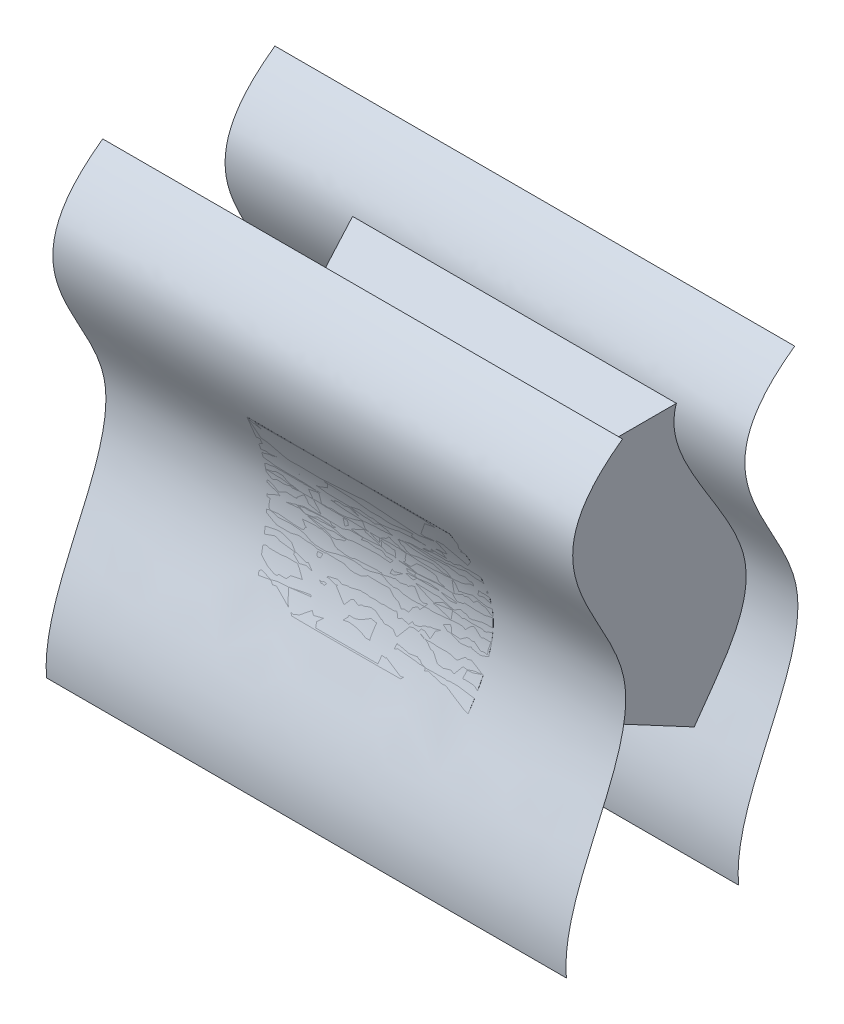
ISO-10303-21;
HEADER;
FILE_DESCRIPTION(('STEP AP214'),'2;1');
FILE_NAME('part.step','',(''),(''),'','','');
FILE_SCHEMA(('AUTOMOTIVE_DESIGN { 1 0 10303 214 1 1 1 1 }'));
ENDSEC;
DATA;
#1=APPLICATION_CONTEXT('core data for automotive mechanical design processes');
#2=APPLICATION_PROTOCOL_DEFINITION('international standard','automotive_design',2000,#1);
#3=PRODUCT_CONTEXT('',#1,'mechanical');
#4=PRODUCT('Part','Part','',(#3));
#5=PRODUCT_RELATED_PRODUCT_CATEGORY('part','',(#4));
#6=PRODUCT_DEFINITION_FORMATION('','',#4);
#7=PRODUCT_DEFINITION_CONTEXT('part definition',#1,'design');
#8=PRODUCT_DEFINITION('design','',#6,#7);
#9=PRODUCT_DEFINITION_SHAPE('','',#8);
#10=(LENGTH_UNIT() NAMED_UNIT(*) SI_UNIT(.MILLI.,.METRE.));
#11=(NAMED_UNIT(*) PLANE_ANGLE_UNIT() SI_UNIT($,.RADIAN.));
#12=(NAMED_UNIT(*) SI_UNIT($,.STERADIAN.) SOLID_ANGLE_UNIT());
#13=UNCERTAINTY_MEASURE_WITH_UNIT(LENGTH_MEASURE(1.E-05),#10,'distance_accuracy_value','');
#14=(GEOMETRIC_REPRESENTATION_CONTEXT(3) GLOBAL_UNCERTAINTY_ASSIGNED_CONTEXT((#13)) GLOBAL_UNIT_ASSIGNED_CONTEXT((#10,
#11,#12)) REPRESENTATION_CONTEXT('',''));
#15=CARTESIAN_POINT('',(0.,0.,0.));
#16=DIRECTION('',(0.,0.,1.));
#17=DIRECTION('',(1.,0.,0.));
#18=AXIS2_PLACEMENT_3D('',#15,#16,#17);
#19=CARTESIAN_POINT('',(-1.52422926449016,4.01313395986018,2.66228518325588));
#20=CARTESIAN_POINT('',(-1.52422926449016,-4.69428085802712,14.918114521293));
#21=CARTESIAN_POINT('',(-1.52422926449016,-20.0739613564952,-7.61610162007118));
#22=CARTESIAN_POINT('',(-1.52422926449016,-37.4957926802031,9.91644933925024));
#23=CARTESIAN_POINT('',(-1.52422926449016,-46.626542049612,9.14556550280767));
#24=B_SPLINE_CURVE_WITH_KNOTS('',3,(#19,#20,#21,#22,#23),.UNSPECIFIED.,.F.,.F.,(4,1,4),(0.,
0.484609084090598,1.),.UNSPECIFIED.);
#25=DIRECTION('',(1.,0.,0.));
#26=VECTOR('',#25,1.);
#27=SURFACE_OF_LINEAR_EXTRUSION('',#24,#26);
#28=CARTESIAN_POINT('',(48.4757707355098,4.01313395986018,2.66228518325588));
#29=CARTESIAN_POINT('',(48.4757707355098,-4.69428085802712,14.918114521293));
#30=CARTESIAN_POINT('',(48.4757707355098,-20.0739613564952,-7.61610162007118));
#31=CARTESIAN_POINT('',(48.4757707355098,-37.4957926802031,9.91644933925024));
#32=CARTESIAN_POINT('',(48.4757707355098,-46.626542049612,9.14556550280767));
#33=B_SPLINE_CURVE_WITH_KNOTS('',3,(#28,#29,#30,#31,#32),.UNSPECIFIED.,.F.,.F.,(4,1,4),(0.,
0.484609084090598,1.),.UNSPECIFIED.);
#34=CARTESIAN_POINT('',(48.4757707355098,4.01313395986018,2.66228518325588));
#35=VERTEX_POINT('',#34);
#36=CARTESIAN_POINT('',(48.4757707355098,-46.626542049612,9.14556550280767));
#37=VERTEX_POINT('',#36);
#38=EDGE_CURVE('E61',#35,#37,#33,.T.);
#39=ORIENTED_EDGE('',*,*,#38,.F.);
#40=DIRECTION('',(1.,0.,0.));
#41=VECTOR('',#40,1.);
#42=CARTESIAN_POINT('',(-1.52422926449016,4.01313395986018,2.66228518325588));
#43=LINE('',#42,#41);
#44=CARTESIAN_POINT('',(-11.5242292644902,4.01313395986018,2.66228518325588));
#45=VERTEX_POINT('',#44);
#46=EDGE_CURVE('E53',#45,#35,#43,.T.);
#47=ORIENTED_EDGE('',*,*,#46,.F.);
#48=CARTESIAN_POINT('',(-11.5242292644902,4.01313395986018,2.66228518325588));
#49=CARTESIAN_POINT('',(-11.5242292644902,-4.69428085802712,14.918114521293));
#50=CARTESIAN_POINT('',(-11.5242292644902,-20.0739613564952,-7.61610162007118));
#51=CARTESIAN_POINT('',(-11.5242292644902,-37.4957926802031,9.91644933925024));
#52=CARTESIAN_POINT('',(-11.5242292644902,-46.626542049612,9.14556550280767));
#53=B_SPLINE_CURVE_WITH_KNOTS('',3,(#48,#49,#50,#51,#52),.UNSPECIFIED.,.F.,.F.,(4,1,4),(0.,
0.484609084090598,1.),.UNSPECIFIED.);
#54=CARTESIAN_POINT('',(-11.5242292644902,-46.626542049612,9.14556550280767));
#55=VERTEX_POINT('',#54);
#56=EDGE_CURVE('E71',#45,#55,#53,.T.);
#57=ORIENTED_EDGE('',*,*,#56,.T.);
#58=DIRECTION('',(1.,0.,0.));
#59=VECTOR('',#58,1.);
#60=CARTESIAN_POINT('',(-1.52422926449016,-46.626542049612,9.14556550280767));
#61=LINE('',#60,#59);
#62=EDGE_CURVE('E12',#55,#37,#61,.T.);
#63=ORIENTED_EDGE('',*,*,#62,.T.);
#64=EDGE_LOOP('',(#39,#47,#57,#63));
#65=FACE_BOUND('',#64,.T.);
#66=ADVANCED_FACE('F51',(#65),#27,.T.);
#67=OPEN_SHELL('',(#66));
#68=SHELL_BASED_SURFACE_MODEL('B2',(#67));
#69=CARTESIAN_POINT('',(0.,6.18998145234106,24.0617093417306));
#70=CARTESIAN_POINT('',(0.,-2.51743336554624,36.3175386797677));
#71=CARTESIAN_POINT('',(0.,-17.8971138640143,13.7833225384035));
#72=CARTESIAN_POINT('',(0.,-35.3189451877222,31.3158734977249));
#73=CARTESIAN_POINT('',(0.,-44.4496945571311,30.5449896612824));
#74=B_SPLINE_CURVE_WITH_KNOTS('',3,(#69,#70,#71,#72,#73),.UNSPECIFIED.,.F.,.F.,(4,1,4),(0.,
0.484609084090598,1.),.UNSPECIFIED.);
#75=DIRECTION('',(1.,0.,0.));
#76=VECTOR('',#75,1.);
#77=SURFACE_OF_LINEAR_EXTRUSION('',#74,#76);
#78=CARTESIAN_POINT('',(50.,6.18998145234106,24.0617093417306));
#79=CARTESIAN_POINT('',(50.,-2.51743336554624,36.3175386797677));
#80=CARTESIAN_POINT('',(50.,-17.8971138640143,13.7833225384035));
#81=CARTESIAN_POINT('',(50.,-35.3189451877222,31.3158734977249));
#82=CARTESIAN_POINT('',(50.,-44.4496945571311,30.5449896612824));
#83=B_SPLINE_CURVE_WITH_KNOTS('',3,(#78,#79,#80,#81,#82),.UNSPECIFIED.,.F.,.F.,(4,1,4),(0.,
0.484609084090598,1.),.UNSPECIFIED.);
#84=CARTESIAN_POINT('',(50.,6.18998145234106,24.0617093417306));
#85=VERTEX_POINT('',#84);
#86=CARTESIAN_POINT('',(50.,-44.4496945571311,30.5449896612824));
#87=VERTEX_POINT('',#86);
#88=EDGE_CURVE('E131',#85,#87,#83,.T.);
#89=ORIENTED_EDGE('',*,*,#88,.F.);
#90=DIRECTION('',(1.,0.,0.));
#91=VECTOR('',#90,1.);
#92=CARTESIAN_POINT('',(0.,6.18998145234106,24.0617093417306));
#93=LINE('',#92,#91);
#94=CARTESIAN_POINT('',(-10.,6.18998145234106,24.0617093417306));
#95=VERTEX_POINT('',#94);
#96=EDGE_CURVE('E123',#95,#85,#93,.T.);
#97=ORIENTED_EDGE('',*,*,#96,.F.);
#98=CARTESIAN_POINT('',(-10.,6.18998145234106,24.0617093417306));
#99=CARTESIAN_POINT('',(-10.,-2.51743336554624,36.3175386797677));
#100=CARTESIAN_POINT('',(-10.,-17.8971138640143,13.7833225384035));
#101=CARTESIAN_POINT('',(-10.,-35.3189451877222,31.3158734977249));
#102=CARTESIAN_POINT('',(-10.,-44.4496945571311,30.5449896612824));
#103=B_SPLINE_CURVE_WITH_KNOTS('',3,(#98,#99,#100,#101,#102),.UNSPECIFIED.,.F.,.F.,(4,1,4),(0.,
0.484609084090598,1.),.UNSPECIFIED.);
#104=CARTESIAN_POINT('',(-10.,-44.4496945571311,30.5449896612824));
#105=VERTEX_POINT('',#104);
#106=EDGE_CURVE('E141',#95,#105,#103,.T.);
#107=ORIENTED_EDGE('',*,*,#106,.T.);
#108=DIRECTION('',(1.,0.,0.));
#109=VECTOR('',#108,1.);
#110=CARTESIAN_POINT('',(0.,-44.4496945571311,30.5449896612824));
#111=LINE('',#110,#109);
#112=EDGE_CURVE('E49',#105,#87,#111,.T.);
#113=ORIENTED_EDGE('',*,*,#112,.T.);
#114=EDGE_LOOP('',(#89,#97,#107,#113));
#115=FACE_BOUND('',#114,.T.);
#116=ADVANCED_FACE('F121',(#115),#77,.T.);
#117=OPEN_SHELL('',(#116));
#118=SHELL_BASED_SURFACE_MODEL('B6',(#117));
#119=CARTESIAN_POINT('',(0.,0.,0.));
#120=DIRECTION('',(-0.939692620785908,0.,0.342020143325669));
#121=DIRECTION('',(0.342020143325669,0.,0.939692620785908));
#122=AXIS2_PLACEMENT_3D('',#119,#120,#121);
#123=PLANE('',#122);
#124=CARTESIAN_POINT('',(2.9876665244987,-2.9876665244987,8.20854631292063));
#125=CARTESIAN_POINT('',(2.9972551182165,-3.10072374419156,8.2348907576446));
#126=CARTESIAN_POINT('',(3.00591501438279,-3.21445332463872,8.2586836268163));
#127=CARTESIAN_POINT('',(3.02135991706898,-3.4429882873727,8.30111814819229));
#128=CARTESIAN_POINT('',(3.02814504045837,-3.55779360213894,8.31976012149285));
#129=CARTESIAN_POINT('',(3.03981520523351,-3.78804972163956,8.35182363569388));
#130=CARTESIAN_POINT('',(3.04470312605109,-3.90349927628609,8.36525308776825));
#131=CARTESIAN_POINT('',(3.05260455180938,-4.13493618541207,8.38696207662065));
#132=CARTESIAN_POINT('',(3.05561804943225,-4.25092354198936,8.39524159329305));
#133=CARTESIAN_POINT('',(3.06180950570983,-4.59515875538895,8.41225247960925));
#134=CARTESIAN_POINT('',(3.06234637991077,-4.82385505361472,8.41372752935344));
#135=CARTESIAN_POINT('',(3.05671077914176,-5.28052847385759,8.3982438434955));
#136=CARTESIAN_POINT('',(3.05053588308327,-5.5085053065874,8.38127845600733));
#137=CARTESIAN_POINT('',(3.02866760758411,-6.04687586202529,8.32119586287096));
#138=CARTESIAN_POINT('',(3.01028556730297,-6.35633966601876,8.27069162227503));
#139=CARTESIAN_POINT('',(2.96396362665807,-6.9690679357488,8.14342313632786));
#140=CARTESIAN_POINT('',(2.93601796933866,-7.27232855058833,8.06664307387097));
#141=CARTESIAN_POINT('',(2.87222734797819,-7.87419434501463,7.89137978211009));
#142=CARTESIAN_POINT('',(2.83632119557993,-8.17274314973624,7.79272843917638));
#143=CARTESIAN_POINT('',(2.75849081821395,-8.7628174569167,7.5788912348157));
#144=CARTESIAN_POINT('',(2.71656905482476,-9.05434577544068,7.46371213652018));
#145=CARTESIAN_POINT('',(2.63678293415388,-9.57507994680996,7.24450157159106));
#146=CARTESIAN_POINT('',(2.59972185619697,-9.80535165069111,7.14267709676381));
#147=CARTESIAN_POINT('',(2.52328357452186,-10.2625973495167,6.93266464387954));
#148=CARTESIAN_POINT('',(2.48390615459335,-10.4895710341463,6.82447607178957));
#149=CARTESIAN_POINT('',(2.40337093254823,-10.9410466552401,6.60320736774985));
#150=CARTESIAN_POINT('',(2.36221155255672,-11.1655461707638,6.49012290062442));
#151=CARTESIAN_POINT('',(2.27864570556818,-11.6125581980294,6.26052762298581));
#152=CARTESIAN_POINT('',(2.23623918007341,-11.8350706159256,6.14401665175139));
#153=CARTESIAN_POINT('',(2.1077458381293,-12.5011640713613,5.79098409620969));
#154=CARTESIAN_POINT('',(2.02048032059958,-12.9427837565999,5.55122405729978));
#155=CARTESIAN_POINT('',(1.84631508206139,-13.8256801063325,5.07270899716217));
#156=CARTESIAN_POINT('',(1.75941499537339,-14.2669561388336,4.83395297123825));
#157=CARTESIAN_POINT('',(1.63182230021199,-14.9330947459998,4.48339492239493));
#158=CARTESIAN_POINT('',(1.58977386371592,-15.155718569538,4.3678677925986));
#159=CARTESIAN_POINT('',(1.50705367905619,-15.6031355269338,4.14059595311289));
#160=CARTESIAN_POINT('',(1.46638185343009,-15.8279285378125,4.02885103059719));
#161=CARTESIAN_POINT('',(1.38694396324922,-16.280299838458,3.81059722107611));
#162=CARTESIAN_POINT('',(1.34817730102155,-16.5078772263868,3.70408669197797));
#163=CARTESIAN_POINT('',(1.27313142200774,-16.9664982385328,3.49789983396441));
#164=CARTESIAN_POINT('',(1.23685183751461,-17.197541344171,3.39822249478234));
#165=CARTESIAN_POINT('',(1.17590221334383,-17.6069550876531,3.23076477864887));
#166=CARTESIAN_POINT('',(1.15055534072074,-17.7844623560215,3.16112481846314));
#167=CARTESIAN_POINT('',(1.10200673914472,-18.142009582896,3.02773863188692));
#168=CARTESIAN_POINT('',(1.0788053061433,-18.3220498868854,2.96399321861653));
#169=CARTESIAN_POINT('',(1.03493528652325,-18.6846723682696,2.84346133031943));
#170=CARTESIAN_POINT('',(1.01426555014238,-18.8672533495548,2.78667169634689));
#171=CARTESIAN_POINT('',(0.975858419927004,-19.2349812477879,2.6811489733341));
#172=CARTESIAN_POINT('',(0.958119990158336,-19.4201272330752,2.63241303808811));
#173=CARTESIAN_POINT('',(0.926134965858192,-19.791575540318,2.54453490606275));
#174=CARTESIAN_POINT('',(0.911863967062016,-19.9778597223472,2.5053256591172));
#175=CARTESIAN_POINT('',(0.88703598731128,-20.3526079267306,2.43711134538137));
#176=CARTESIAN_POINT('',(0.876480354920777,-20.5410727149942,2.4081099837404));
#177=CARTESIAN_POINT('',(0.859003373300636,-20.9194677441431,2.36009237137884));
#178=CARTESIAN_POINT('',(0.852082763682711,-21.1093982752898,2.34107815272473));
#179=CARTESIAN_POINT('',(0.841776206072706,-21.4900314372436,2.31276111841893));
#180=CARTESIAN_POINT('',(0.838389629493185,-21.6807339246855,2.30345657573745));
#181=CARTESIAN_POINT('',(0.834441767041166,-22.123945506082,2.29260991279541));
#182=CARTESIAN_POINT('',(0.83514373425192,-22.3765545472388,2.29453855185616));
#183=CARTESIAN_POINT('',(0.841992367854425,-22.8811376942549,2.31335501803316));
#184=CARTESIAN_POINT('',(0.848139866701164,-23.1331116971299,2.3302451323007));
#185=CARTESIAN_POINT('',(0.865359261704185,-23.63561514478,2.37755503124817));
#186=CARTESIAN_POINT('',(0.876431618087728,-23.8861444523316,2.4079760803921));
#187=CARTESIAN_POINT('',(0.90319702983536,-24.3896302155137,2.48151344479113));
#188=CARTESIAN_POINT('',(0.918968888912201,-24.6425503991794,2.52484627146757));
#189=CARTESIAN_POINT('',(0.954491738095091,-25.1459060199011,2.62244449747225));
#190=CARTESIAN_POINT('',(0.974241807112793,-25.3963420180715,2.67670736613106));
#191=CARTESIAN_POINT('',(1.01719121715819,-25.8945761719755,2.79470990040967));
#192=CARTESIAN_POINT('',(1.04038959960546,-26.1423750403433,2.85844693235143));
#193=CARTESIAN_POINT('',(1.09899522823657,-26.727711398352,3.01946457366835));
#194=CARTESIAN_POINT('',(1.13572191703173,-27.0641170345118,3.12037032182438));
#195=CARTESIAN_POINT('',(1.21366616556173,-27.7324724688052,3.33452038463693));
#196=CARTESIAN_POINT('',(1.25488463596444,-28.0644213479922,3.44776720133284));
#197=CARTESIAN_POINT('',(1.34088748755272,-28.7247237727867,3.68405809408033));
#198=CARTESIAN_POINT('',(1.38567561050195,-29.0530731242125,3.80711245054311));
#199=CARTESIAN_POINT('',(1.47799393715686,-29.7068954592558,4.06075496842929));
#200=CARTESIAN_POINT('',(1.52552734128805,-30.0323645539462,4.19135192294955));
#201=CARTESIAN_POINT('',(1.62258883475532,-30.681059396535,4.45802618454942));
#202=CARTESIAN_POINT('',(1.67211855239364,-31.0042830503045,4.59410796535265));
#203=CARTESIAN_POINT('',(1.7692662647474,-31.6284007109605,4.8610191113963));
#204=CARTESIAN_POINT('',(1.81680418365874,-31.9294018151631,4.99162847017307));
#205=CARTESIAN_POINT('',(1.91248474122992,-32.5303527787303,5.2545086415807));
#206=CARTESIAN_POINT('',(1.9606269897462,-32.830303171032,5.38677838230096));
#207=CARTESIAN_POINT('',(2.0569978044755,-33.4295295689778,5.65155501966415));
#208=CARTESIAN_POINT('',(2.10522612964553,-33.7288059080916,5.78406125404693));
#209=CARTESIAN_POINT('',(2.20126550547599,-34.3270436214445,6.04792727051964));
#210=CARTESIAN_POINT('',(2.24907728672307,-34.6260039851368,6.1792890598799));
#211=CARTESIAN_POINT('',(2.34378364545697,-35.2239542804302,6.43949264198005));
#212=CARTESIAN_POINT('',(2.39068074572801,-35.5229408028951,6.56834136601262));
#213=CARTESIAN_POINT('',(2.43697260935573,-35.822740495434,6.69552721603427));
#214=B_SPLINE_CURVE_WITH_KNOTS('',3,(#124,#125,#126,#127,#128,#129,#130,#131,#132,#133,#134,
#135,#136,#137,#138,#139,#140,#141,#142,#143,#144,#145,#146,#147,#148,#149,#150,#151,#152,#153,
#154,#155,#156,#157,#158,#159,#160,#161,#162,#163,#164,#165,#166,#167,#168,#169,#170,#171,#172,
#173,#174,#175,#176,#177,#178,#179,#180,#181,#182,#183,#184,#185,#186,#187,#188,#189,#190,#191,
#192,#193,#194,#195,#196,#197,#198,#199,#200,#201,#202,#203,#204,#205,#206,#207,#208,#209,#210,
#211,#212,#213),.UNSPECIFIED.,.F.,.F.,(4,2,2,2,2,2,2,2,2,2,2,2,2,2,2,2,2,2,2,2,2,2,2,2,2,2,2,2,
2,2,2,2,2,2,2,2,2,2,2,2,2,2,2,2,4),(0.,0.349408822123913,0.698795857903406,1.04765052714846,
1.39650655833239,2.08160997002687,2.76696059617885,3.70758080950924,4.6487682414783,
5.59745769690426,6.54576005128864,7.3091127095846,8.0725367336027,8.83665115614336,
9.60080147705313,11.1308640041962,12.6584078863827,13.4213216204485,14.1841923534422,
14.946822216605,15.7093390829659,16.2863099534718,16.8633602955516,17.4401475925706,
18.016730612954,18.5891296923225,19.1617363212696,19.7344594123958,20.307080617679,
21.0643574961891,21.8217501591202,22.5792136151671,23.3501712900211,24.1209506672066,
24.891516178385,25.950538767794,27.0097764652591,28.0701394551604,29.1317645883861,
30.1942738959334,31.1888901428149,32.182894309456,33.1753935258469,34.1654733940416,
35.1522584855172),.UNSPECIFIED.);
#215=CARTESIAN_POINT('',(2.9876665244987,-2.9876665244987,8.20854631292063));
#216=VERTEX_POINT('',#215);
#217=CARTESIAN_POINT('',(2.43697260935574,-35.822740495434,6.69552721603427));
#218=VERTEX_POINT('',#217);
#219=EDGE_CURVE('E240',#216,#218,#214,.T.);
#220=ORIENTED_EDGE('',*,*,#219,.T.);
#221=DIRECTION('',(-0.323615577118185,-0.323615577118185,-0.889126490715988));
#222=VECTOR('',#221,1.);
#223=CARTESIAN_POINT('',(0.,-38.2597131047897,0.));
#224=LINE('',#223,#222);
#225=CARTESIAN_POINT('',(9.45729808338407,-28.8024150214057,25.9837129331492));
#226=VERTEX_POINT('',#225);
#227=EDGE_CURVE('E119',#226,#218,#224,.T.);
#228=ORIENTED_EDGE('',*,*,#227,.F.);
#229=CARTESIAN_POINT('',(9.96566052894238,-9.96566052894238,27.3804272732193));
#230=CARTESIAN_POINT('',(9.92685018901015,-10.1662302755172,27.2737967406142));
#231=CARTESIAN_POINT('',(9.88774327394846,-10.3663030676911,27.1663513745377));
#232=CARTESIAN_POINT('',(9.80909820646466,-10.7667209052558,26.9502758274744));
#233=CARTESIAN_POINT('',(9.76955898737714,-10.9670641628169,26.8416427158486));
#234=CARTESIAN_POINT('',(9.69040198883556,-11.3683246393751,26.6241606497638));
#235=CARTESIAN_POINT('',(9.65078427855441,-11.5692419735998,26.5153118853558));
#236=CARTESIAN_POINT('',(9.57182703672667,-11.9719632659182,26.2983786463317));
#237=CARTESIAN_POINT('',(9.53248803722567,-12.1737681192705,26.1902956334988));
#238=CARTESIAN_POINT('',(9.45445605379572,-12.5785946740958,25.9759045210297));
#239=CARTESIAN_POINT('',(9.41576344171993,-12.781616990481,25.8695974430518));
#240=CARTESIAN_POINT('',(9.33812473726114,-13.1960777373947,25.6562868556755));
#241=CARTESIAN_POINT('',(9.29921302943347,-13.4075714716265,25.5493778170666));
#242=CARTESIAN_POINT('',(9.22292898799617,-13.8326961258691,25.3397891357529));
#243=CARTESIAN_POINT('',(9.18555534994728,-14.0463250355761,25.2371059091307));
#244=CARTESIAN_POINT('',(9.11282281153924,-14.4762137153775,25.037274902195));
#245=CARTESIAN_POINT('',(9.07746170626768,-14.6924702785184,24.9401210639344));
#246=CARTESIAN_POINT('',(9.00927247340223,-15.128165263332,24.7527726863867));
#247=CARTESIAN_POINT('',(8.97644220158084,-15.3476008001322,24.6625722558828));
#248=CARTESIAN_POINT('',(8.91388613578072,-15.7902948221348,24.4907008776471));
#249=CARTESIAN_POINT('',(8.88416077765239,-16.0135538389496,24.4090311274043));
#250=CARTESIAN_POINT('',(8.83584868866706,-16.4047854589981,24.2762947538304));
#251=CARTESIAN_POINT('',(8.81638999902506,-16.5718360850759,24.2228324434269));
#252=CARTESIAN_POINT('',(8.77984978469958,-16.9081911937868,24.1224390296656));
#253=CARTESIAN_POINT('',(8.76276869805376,-17.0774960854559,24.0755091298064));
#254=CARTESIAN_POINT('',(8.73132415419315,-17.4181971858704,23.9891159555844));
#255=CARTESIAN_POINT('',(8.71695954235333,-17.5895924729778,23.9496495089152));
#256=CARTESIAN_POINT('',(8.69771741377841,-17.8481137360389,23.8967821951534));
#257=CARTESIAN_POINT('',(8.69168811140681,-17.9345146694784,23.8802168230323));
#258=CARTESIAN_POINT('',(8.68042087515035,-18.107756461371,23.8492603458381));
#259=CARTESIAN_POINT('',(8.67518294460728,-18.1945973216802,23.8348692499463));
#260=CARTESIAN_POINT('',(8.66077868213956,-18.4532612959753,23.7952938640724));
#261=CARTESIAN_POINT('',(8.65274322254546,-18.62563372449,23.7732166202826));
#262=CARTESIAN_POINT('',(8.63965760388117,-18.9714318790573,23.7372641784829));
#263=CARTESIAN_POINT('',(8.63460917964813,-19.1448581582246,23.7233937468988));
#264=CARTESIAN_POINT('',(8.62740258539165,-19.4922962066346,23.7035937919079));
#265=CARTESIAN_POINT('',(8.62524565716517,-19.6663081952782,23.6976676803103));
#266=CARTESIAN_POINT('',(8.62369693341634,-20.0144209787687,23.6934125967814));
#267=CARTESIAN_POINT('',(8.62430509728726,-20.1885217722739,23.6950835132841));
#268=CARTESIAN_POINT('',(8.62945182320703,-20.6558596655785,23.7092240265328));
#269=CARTESIAN_POINT('',(8.63640059305044,-20.9488871734121,23.7283156147705));
#270=CARTESIAN_POINT('',(8.65692250275788,-21.532909633559,23.7846990982958));
#271=CARTESIAN_POINT('',(8.67049650167406,-21.8239043173242,23.8219933538097));
#272=CARTESIAN_POINT('',(8.70341995119887,-22.4030839140823,23.9124497879497));
#273=CARTESIAN_POINT('',(8.72277008861089,-22.6912684887329,23.9656138535526));
#274=CARTESIAN_POINT('',(8.7667313998706,-23.268417074743,24.0863965635682));
#275=CARTESIAN_POINT('',(8.79141295931987,-23.5573347011386,24.154208590832));
#276=CARTESIAN_POINT('',(8.84507201483249,-24.1316457010319,24.3016356342022));
#277=CARTESIAN_POINT('',(8.87404867447462,-24.4170397490097,24.3812483522602));
#278=CARTESIAN_POINT('',(8.93558847726278,-24.9844694736127,24.5503275708183));
#279=CARTESIAN_POINT('',(8.9681514915966,-25.2665052704543,24.6397937174099));
#280=CARTESIAN_POINT('',(9.02477280059314,-25.733053097682,24.7953594853378));
#281=CARTESIAN_POINT('',(9.048003657157,-25.9184319233605,24.8591857391816));
#282=CARTESIAN_POINT('',(9.09559808340548,-26.2879122187071,24.9899503505912));
#283=CARTESIAN_POINT('',(9.1199614940057,-26.4720138636246,25.0568882710762));
#284=CARTESIAN_POINT('',(9.16966991517095,-26.8390775957238,25.1934610357845));
#285=CARTESIAN_POINT('',(9.19501492578697,-27.0220396828463,25.2630958801479));
#286=CARTESIAN_POINT('',(9.24603367544966,-27.383329066899,25.4032687428149));
#287=CARTESIAN_POINT('',(9.27169092109309,-27.561676309367,25.4737614458656));
#288=CARTESIAN_POINT('',(9.3236870899834,-27.9175144159599,25.6166197457899));
#289=CARTESIAN_POINT('',(9.35002600394254,-28.0950052917138,25.6889853171456));
#290=CARTESIAN_POINT('',(9.40326737128786,-28.4492360186888,25.8352647717078));
#291=CARTESIAN_POINT('',(9.43016975073662,-28.6259759648303,25.9091784517728));
#292=CARTESIAN_POINT('',(9.4572980833841,-28.8024150214057,25.9837129331492));
#293=B_SPLINE_CURVE_WITH_KNOTS('',3,(#229,#230,#231,#232,#233,#234,#235,#236,#237,#238,#239,
#240,#241,#242,#243,#244,#245,#246,#247,#248,#249,#250,#251,#252,#253,#254,#255,#256,#257,#258,
#259,#260,#261,#262,#263,#264,#265,#266,#267,#268,#269,#270,#271,#272,#273,#274,#275,#276,#277,
#278,#279,#280,#281,#282,#283,#284,#285,#286,#287,#288,#289,#290,#291,#292),.UNSPECIFIED.,.F.,
.F.,(4,2,2,2,2,2,2,2,2,2,2,2,2,2,2,2,2,2,2,2,2,2,2,2,2,2,2,2,2,2,2,4),(0.,0.691323283928701,
1.38523635816184,2.08098667846788,2.77782526529945,3.47505180697966,4.19547185161754,
4.91526775640306,5.63425924622486,6.35263472419253,7.07111090854643,7.60040035672205,
8.1297871898328,8.658948501271,8.92346311569814,9.18797884707696,9.70962778523814,
10.231579394704,10.753755092497,11.2759231219084,12.1563244150852,13.0368398947487,
13.9174601125627,14.8105067850571,15.7033797749435,16.5962207056872,17.1884813729679,
17.780659098151,18.3728368540921,18.9532680285219,19.5336912987269,20.1140388776575),.UNSPECIFIED.);
#294=CARTESIAN_POINT('',(9.96566052894238,-9.96566052894238,27.3804272732193));
#295=VERTEX_POINT('',#294);
#296=EDGE_CURVE('E236',#295,#226,#293,.T.);
#297=ORIENTED_EDGE('',*,*,#296,.F.);
#298=DIRECTION('',(-0.323615577118185,0.323615577118185,-0.889126490715988));
#299=VECTOR('',#298,1.);
#300=CARTESIAN_POINT('',(0.,0.,0.));
#301=LINE('',#300,#299);
#302=EDGE_CURVE('E231',#295,#216,#301,.T.);
#303=ORIENTED_EDGE('',*,*,#302,.T.);
#304=EDGE_LOOP('',(#220,#228,#297,#303));
#305=FACE_BOUND('',#304,.T.);
#306=ADVANCED_FACE('F182',(#305),#123,.T.);
#307=CARTESIAN_POINT('',(0.,-38.2597131047897,0.));
#308=DIRECTION('',(0.,-0.939692620785908,0.342020143325669));
#309=DIRECTION('',(0.,-0.342020143325669,-0.939692620785908));
#310=AXIS2_PLACEMENT_3D('',#307,#308,#309);
#311=PLANE('',#310);
#312=DIRECTION('',(1.,0.,0.));
#313=VECTOR('',#312,1.);
#314=CARTESIAN_POINT('',(21.6753616581571,-35.8227404954339,6.69552721603426));
#315=LINE('',#314,#313);
#316=CARTESIAN_POINT('',(40.9137507069584,-35.822740495434,6.69552721603427));
#317=VERTEX_POINT('',#316);
#318=EDGE_CURVE('E242',#218,#317,#315,.T.);
#319=ORIENTED_EDGE('',*,*,#318,.T.);
#320=DIRECTION('',(0.323615577118185,-0.323615577118185,-0.889126490715988));
#321=VECTOR('',#320,1.);
#322=CARTESIAN_POINT('',(39.3438967445105,-34.2528865329861,11.0086655297012));
#323=LINE('',#322,#321);
#324=CARTESIAN_POINT('',(33.89342523293,-28.8024150214057,25.9837129331492));
#325=VERTEX_POINT('',#324);
#326=EDGE_CURVE('E194',#325,#317,#323,.T.);
#327=ORIENTED_EDGE('',*,*,#326,.F.);
#328=DIRECTION('',(1.,0.,0.));
#329=VECTOR('',#328,1.);
#330=CARTESIAN_POINT('',(21.6753616581571,-28.8024150214056,25.9837129331492));
#331=LINE('',#330,#329);
#332=EDGE_CURVE('E250',#226,#325,#331,.T.);
#333=ORIENTED_EDGE('',*,*,#332,.F.);
#334=ORIENTED_EDGE('',*,*,#227,.T.);
#335=EDGE_LOOP('',(#319,#327,#333,#334));
#336=FACE_BOUND('',#335,.T.);
#337=ADVANCED_FACE('F258',(#336),#311,.T.);
#338=CARTESIAN_POINT('',(43.3507233163141,0.,0.));
#339=DIRECTION('',(0.939692620785908,0.,0.342020143325669));
#340=DIRECTION('',(0.342020143325669,0.,-0.939692620785908));
#341=AXIS2_PLACEMENT_3D('',#338,#339,#340);
#342=PLANE('',#341);
#343=CARTESIAN_POINT('',(40.9137507069584,-35.822740495434,6.69552721603427));
#344=CARTESIAN_POINT('',(40.9637624344808,-35.4988524156093,6.55812112395854));
#345=CARTESIAN_POINT('',(41.0144798611963,-35.1759146492827,6.41877613928472));
#346=CARTESIAN_POINT('',(41.1175571221776,-34.5260977454529,6.13557369227962));
#347=CARTESIAN_POINT('',(41.1699302428618,-34.1992365838791,5.9916797258132));
#348=CARTESIAN_POINT('',(41.2755740690052,-33.5419280183179,5.70142569897935));
#349=CARTESIAN_POINT('',(41.328847969481,-33.2114850509332,5.55505686037586));
#350=CARTESIAN_POINT('',(41.4354988627867,-32.5472880603214,5.26203593925388));
#351=CARTESIAN_POINT('',(41.4888728442513,-32.2135298789955,5.11539213039362));
#352=CARTESIAN_POINT('',(41.5948755472035,-31.5429067449013,4.82415209763118));
#353=CARTESIAN_POINT('',(41.6474990079879,-31.2060346461604,4.6795703273925));
#354=CARTESIAN_POINT('',(41.7510996330159,-30.529315466425,4.39492994948667));
#355=CARTESIAN_POINT('',(41.80207330981,-30.1894637966879,4.25488092350841));
#356=CARTESIAN_POINT('',(41.9045848517295,-29.485094324419,3.97323277685094));
#357=CARTESIAN_POINT('',(41.9559568583758,-29.1203686044235,3.8320893485983));
#358=CARTESIAN_POINT('',(42.054556988361,-28.3874155878562,3.56118771790847));
#359=CARTESIAN_POINT('',(42.1017973805894,-28.0192025256592,3.43139580697483));
#360=CARTESIAN_POINT('',(42.1908231351921,-27.2790856614395,3.18679955645403));
#361=CARTESIAN_POINT('',(42.2326332912146,-26.907207623784,3.07192709687837));
#362=CARTESIAN_POINT('',(42.3093784105178,-26.1594666361612,2.86107161453955));
#363=CARTESIAN_POINT('',(42.3443481588678,-25.7836346643022,2.7649930205839));
#364=CARTESIAN_POINT('',(42.4058648452868,-25.0276164710243,2.59597731372802));
#365=CARTESIAN_POINT('',(42.4324447366974,-24.647453518861,2.52294966226572));
#366=CARTESIAN_POINT('',(42.4754814422696,-23.8821340146847,2.40470728549856));
#367=CARTESIAN_POINT('',(42.4919407516915,-23.4969787174812,2.35948570452209));
#368=CARTESIAN_POINT('',(42.5068097266927,-22.9456420090822,2.31863353145568));
#369=CARTESIAN_POINT('',(42.5101574261479,-22.7805394796925,2.30943580279547));
#370=CARTESIAN_POINT('',(42.514518118902,-22.4498742672547,2.29745489792043));
#371=CARTESIAN_POINT('',(42.5155285269647,-22.2843112772784,2.29467882458378));
#372=CARTESIAN_POINT('',(42.5150730765363,-21.9531617956516,2.29593016435137));
#373=CARTESIAN_POINT('',(42.5136064754814,-21.787575311839,2.29995961763315));
#374=CARTESIAN_POINT('',(42.5080809726069,-21.4568018766635,2.3151408120118));
#375=CARTESIAN_POINT('',(42.5040226240851,-21.2916148475769,2.32629103293572));
#376=CARTESIAN_POINT('',(42.4933141704184,-20.9648677322429,2.35571226758235));
#377=CARTESIAN_POINT('',(42.4867105426366,-20.8032946677831,2.37385558579921));
#378=CARTESIAN_POINT('',(42.4708550025702,-20.4812691263275,2.41741832410491));
#379=CARTESIAN_POINT('',(42.4616032667695,-20.3208165753844,2.44283725930813));
#380=CARTESIAN_POINT('',(42.4404000057084,-20.0014532498443,2.50109274029249));
#381=CARTESIAN_POINT('',(42.4284486046683,-19.8425424046592,2.53392894478104));
#382=CARTESIAN_POINT('',(42.4020870088245,-19.52652822671,2.60635683410251));
#383=CARTESIAN_POINT('',(42.3876773509887,-19.3694245071904,2.64594704362848));
#384=CARTESIAN_POINT('',(42.3453795479707,-18.9432820556277,2.76215930231285));
#385=CARTESIAN_POINT('',(42.315319888974,-18.6760783719995,2.84474753664284));
#386=CARTESIAN_POINT('',(42.2499325912121,-18.1470458505522,3.0243976607629));
#387=CARTESIAN_POINT('',(42.2145998373188,-17.8852225156204,3.12147360425175));
#388=CARTESIAN_POINT('',(42.1397555291022,-17.3663585400918,3.32710665105179));
#389=CARTESIAN_POINT('',(42.1002383907938,-17.1093248427146,3.43567909623537));
#390=CARTESIAN_POINT('',(42.0180142574258,-16.5996275251678,3.66158804599821));
#391=CARTESIAN_POINT('',(41.9753065752752,-16.3469648608219,3.77892643834424));
#392=CARTESIAN_POINT('',(41.8867008621422,-15.840482567316,4.02236863441175));
#393=CARTESIAN_POINT('',(41.8407579407691,-15.586730522205,4.1485957734683));
#394=CARTESIAN_POINT('',(41.747216942283,-15.0822261491178,4.40559755460197));
#395=CARTESIAN_POINT('',(41.6996207388132,-14.8314708321346,4.5363670488872));
#396=CARTESIAN_POINT('',(41.6034108813472,-14.3318007257964,4.80070145980382));
#397=CARTESIAN_POINT('',(41.5547977211203,-14.0828851191577,4.93426501981569));
#398=CARTESIAN_POINT('',(41.4571495654722,-13.5858076601169,5.20255112251027));
#399=CARTESIAN_POINT('',(41.4081146233889,-13.3376457176256,5.33727351864837));
#400=CARTESIAN_POINT('',(41.2983093510375,-12.7807064046532,5.63896102497089));
#401=CARTESIAN_POINT('',(41.2375830016648,-12.471854270672,5.80580529863832));
#402=CARTESIAN_POINT('',(41.1175113699326,-11.8517137315884,6.13569939553956));
#403=CARTESIAN_POINT('',(41.0581665326751,-11.5404245833285,6.29874799586585));
#404=CARTESIAN_POINT('',(40.9420771515394,-10.9133098732267,6.61770094917454));
#405=CARTESIAN_POINT('',(40.8853351116335,-10.5974803116372,6.77359842254967));
#406=CARTESIAN_POINT('',(40.7765211672485,-9.96296387927048,7.07256227766931));
#407=CARTESIAN_POINT('',(40.7244075961436,-9.64433883918576,7.21574313752723));
#408=CARTESIAN_POINT('',(40.6259467225216,-8.99977186539001,7.48626216450331));
#409=CARTESIAN_POINT('',(40.5795950276651,-8.6738357315497,7.61361239947505));
#410=CARTESIAN_POINT('',(40.4947297227204,-8.01363366883073,7.84677790850578));
#411=CARTESIAN_POINT('',(40.4562053450365,-7.67937990284876,7.95262276629093));
#412=CARTESIAN_POINT('',(40.4078350903727,-7.18902975992311,8.08551894875281));
#413=CARTESIAN_POINT('',(40.3938915579221,-7.03636101539995,8.12382848930845));
#414=CARTESIAN_POINT('',(40.3683067898782,-6.72934746459678,8.19412206179091));
#415=CARTESIAN_POINT('',(40.3566658339148,-6.57500245714588,8.22610532544116));
#416=CARTESIAN_POINT('',(40.3359349679184,-6.26481912466966,8.283062911652));
#417=CARTESIAN_POINT('',(40.3268454789982,-6.10898055752051,8.30803607721472));
#418=CARTESIAN_POINT('',(40.3114823618099,-5.79648169045232,8.35024589478208));
#419=CARTESIAN_POINT('',(40.3052021952317,-5.6398241661197,8.36750051064623));
#420=CARTESIAN_POINT('',(40.2956536207008,-5.32573406387813,8.39373500355768));
#421=CARTESIAN_POINT('',(40.2923848823936,-5.16830157288863,8.40271578824696));
#422=CARTESIAN_POINT('',(40.2890547169697,-4.85320893222404,8.41186534255213));
#423=CARTESIAN_POINT('',(40.2889917411964,-4.69554892926948,8.41203836706715));
#424=CARTESIAN_POINT('',(40.2919385339642,-4.40772966287058,8.40394212047771));
#425=CARTESIAN_POINT('',(40.2944195732538,-4.27752278744004,8.39712552105278));
#426=CARTESIAN_POINT('',(40.3017269735181,-4.01769247932318,8.37704860383181));
#427=CARTESIAN_POINT('',(40.3065528930028,-3.8880689414419,8.3637894990195));
#428=CARTESIAN_POINT('',(40.3186001946709,-3.62919113227635,8.33068980972095));
#429=CARTESIAN_POINT('',(40.3258321018188,-3.49994104570779,8.31082030813268));
#430=CARTESIAN_POINT('',(40.3426690076882,-3.24273183026097,8.26456128944279));
#431=CARTESIAN_POINT('',(40.3522746671335,-3.11477307115716,8.23816995701787));
#432=CARTESIAN_POINT('',(40.3630567918154,-2.98766652449869,8.20854631292062));
#433=B_SPLINE_CURVE_WITH_KNOTS('',3,(#343,#344,#345,#346,#347,#348,#349,#350,#351,#352,#353,
#354,#355,#356,#357,#358,#359,#360,#361,#362,#363,#364,#365,#366,#367,#368,#369,#370,#371,#372,
#373,#374,#375,#376,#377,#378,#379,#380,#381,#382,#383,#384,#385,#386,#387,#388,#389,#390,#391,
#392,#393,#394,#395,#396,#397,#398,#399,#400,#401,#402,#403,#404,#405,#406,#407,#408,#409,#410,
#411,#412,#413,#414,#415,#416,#417,#418,#419,#420,#421,#422,#423,#424,#425,#426,#427,#428,#429,
#430,#431,#432),.UNSPECIFIED.,.F.,.F.,(4,2,2,2,2,2,2,2,2,2,2,2,2,2,2,2,2,2,2,2,2,2,2,2,2,2,2,2,
2,2,2,2,2,2,2,2,2,2,2,2,2,2,2,2,4),(0.,1.06606787924905,2.14891670389178,3.24486158353145,
4.35017455279251,5.46118585967331,6.57440983030369,7.75759334448954,8.9371347974908,
10.1110856515855,11.2789019504575,12.4420725641696,13.6049562795005,14.1010203474247,
14.5976328411295,15.0943942369781,15.5910496174429,16.0790355574087,16.5669889829784,
17.0549199608017,17.5427444938696,18.3859610293237,19.2300009024742,20.0751816760141,
20.9205449887742,21.7818045658072,22.6421180418289,23.5020230784462,24.3618209263479,
25.4305649991975,26.4996487683499,27.5697403379117,28.6289368649324,29.68732093805,
30.7442390447131,31.2181703200025,31.6921591152287,32.1662260950982,32.6391839348767,
33.1120898848462,33.5847673787518,33.9758220555815,34.3668031338284,34.7595175499773,
35.152341399844),.UNSPECIFIED.);
#434=CARTESIAN_POINT('',(40.3630567918154,-2.9876665244987,8.20854631292063));
#435=VERTEX_POINT('',#434);
#436=EDGE_CURVE('E224',#317,#435,#433,.T.);
#437=ORIENTED_EDGE('',*,*,#436,.T.);
#438=DIRECTION('',(0.323615577118185,0.323615577118185,-0.889126490715988));
#439=VECTOR('',#438,1.);
#440=CARTESIAN_POINT('',(38.8107303055205,-4.53999301079362,12.4735282816372));
#441=LINE('',#440,#439);
#442=CARTESIAN_POINT('',(33.3850627873717,-9.96566052894238,27.3804272732193));
#443=VERTEX_POINT('',#442);
#444=EDGE_CURVE('E233',#443,#435,#441,.T.);
#445=ORIENTED_EDGE('',*,*,#444,.F.);
#446=CARTESIAN_POINT('',(33.89342523293,-28.8024150214057,25.9837129331492));
#447=CARTESIAN_POINT('',(33.9348034216966,-28.5332643744685,25.870027293855));
#448=CARTESIAN_POINT('',(33.9756641580797,-28.2634098659951,25.7577633433002));
#449=CARTESIAN_POINT('',(34.0561325676554,-27.7204479422976,25.5366782050116));
#450=CARTESIAN_POINT('',(34.0957326374227,-27.4473309134776,25.4278779075173));
#451=CARTESIAN_POINT('',(34.1731369772677,-26.8979753073125,25.2152112316252));
#452=CARTESIAN_POINT('',(34.2109356145659,-26.621729905238,25.1113603291623));
#453=CARTESIAN_POINT('',(34.2841495232915,-26.0662121391295,24.9102067681487));
#454=CARTESIAN_POINT('',(34.3195622977344,-25.7869369483794,24.8129109700064));
#455=CARTESIAN_POINT('',(34.3886634595706,-25.214819230563,24.6230570882034));
#456=CARTESIAN_POINT('',(34.4222384794053,-24.9218588265306,24.5308104793499));
#457=CARTESIAN_POINT('',(34.4854204511956,-24.3326914652588,24.3572194385396));
#458=CARTESIAN_POINT('',(34.5150325101713,-24.0364892290891,24.2758609751602));
#459=CARTESIAN_POINT('',(34.5694985774038,-23.4407834501915,24.1262166853123));
#460=CARTESIAN_POINT('',(34.5943592632617,-23.1412851756395,24.0579125122857));
#461=CARTESIAN_POINT('',(34.6384748903035,-22.5388653400285,23.9367058231433));
#462=CARTESIAN_POINT('',(34.6577324441527,-22.2359454430973,23.8837961287885));
#463=CARTESIAN_POINT('',(34.6861812964429,-21.6941004991828,23.8056335495119));
#464=CARTESIAN_POINT('',(34.6966549836834,-21.4557526174779,23.7768573303201));
#465=CARTESIAN_POINT('',(34.7131533832377,-20.9776658367605,23.7315283500876));
#466=CARTESIAN_POINT('',(34.7191771503159,-20.7379266531065,23.7149781860601));
#467=CARTESIAN_POINT('',(34.726321489758,-20.2577889295259,23.695349274766));
#468=CARTESIAN_POINT('',(34.7274418546049,-20.0173903621244,23.6922710976476));
#469=CARTESIAN_POINT('',(34.7244017782549,-19.5406251042318,23.7006236387727));
#470=CARTESIAN_POINT('',(34.7203236614291,-19.3042541633828,23.7118281726654));
#471=CARTESIAN_POINT('',(34.7067191944056,-18.8328388084466,23.7492061386164));
#472=CARTESIAN_POINT('',(34.6971933895806,-18.5977942639509,23.7753780722751));
#473=CARTESIAN_POINT('',(34.6786923385326,-18.2472346782931,23.8262092922655));
#474=CARTESIAN_POINT('',(34.6718252249002,-18.1307412617624,23.8450765319076));
#475=CARTESIAN_POINT('',(34.6566665354649,-17.8985443531037,23.8867246888395));
#476=CARTESIAN_POINT('',(34.6483749398256,-17.7828408719992,23.9095056606297));
#477=CARTESIAN_POINT('',(34.6277253955808,-17.5174247033589,23.9662398171642));
#478=CARTESIAN_POINT('',(34.6148964543999,-17.3680249180693,24.0014870433744));
#479=CARTESIAN_POINT('',(34.587187624996,-17.0708618825953,24.077616426481));
#480=CARTESIAN_POINT('',(34.5723075519098,-16.9230987812194,24.1184990912853));
#481=CARTESIAN_POINT('',(34.5248823174852,-16.4819794154556,24.2487988519794));
#482=CARTESIAN_POINT('',(34.4895803156848,-16.1911421513769,24.3457903047875));
#483=CARTESIAN_POINT('',(34.4132449468712,-15.6158855059182,24.5555200069084));
#484=CARTESIAN_POINT('',(34.3722078355835,-15.331470459457,24.6682685435312));
#485=CARTESIAN_POINT('',(34.2851203276311,-14.7640562352437,24.9075395051467));
#486=CARTESIAN_POINT('',(34.239002437846,-14.4811463704429,25.0342473659645));
#487=CARTESIAN_POINT('',(34.1435287135971,-13.9203889325597,25.2965592674894));
#488=CARTESIAN_POINT('',(34.0941757058774,-13.6425372041101,25.4321555417815));
#489=CARTESIAN_POINT('',(33.9932132903971,-13.090417991593,25.7095474985271));
#490=CARTESIAN_POINT('',(33.9416040830818,-12.8161501919229,25.8513426302618));
#491=CARTESIAN_POINT('',(33.8615060370796,-12.3978358521767,26.0714102029955));
#492=CARTESIAN_POINT('',(33.8335117241066,-12.252973263134,26.1483239457619));
#493=CARTESIAN_POINT('',(33.7772540676977,-11.9636900244212,26.3028905864169));
#494=CARTESIAN_POINT('',(33.748990717121,-11.8192693866164,26.3805435039244));
#495=CARTESIAN_POINT('',(33.6923139964877,-11.5306759068405,26.5362615140731));
#496=CARTESIAN_POINT('',(33.6639006227007,-11.3865030711504,26.6143266169635));
#497=CARTESIAN_POINT('',(33.6075298690207,-11.1006945466398,26.769203989817));
#498=CARTESIAN_POINT('',(33.5795730576214,-10.9590578978211,26.8460146978563));
#499=CARTESIAN_POINT('',(33.5237374457656,-10.6756575687762,26.9994217806315));
#500=CARTESIAN_POINT('',(33.4958586433451,-10.5338938918688,27.0760181607635));
#501=CARTESIAN_POINT('',(33.4402908356164,-10.2500570088314,27.2286894577466));
#502=CARTESIAN_POINT('',(33.4126018224639,-10.1079838158183,27.3047643961502));
#503=CARTESIAN_POINT('',(33.3850627873717,-9.96566052894238,27.3804272732193));
#504=B_SPLINE_CURVE_WITH_KNOTS('',3,(#446,#447,#448,#449,#450,#451,#452,#453,#454,#455,#456,
#457,#458,#459,#460,#461,#462,#463,#464,#465,#466,#467,#468,#469,#470,#471,#472,#473,#474,#475,
#476,#477,#478,#479,#480,#481,#482,#483,#484,#485,#486,#487,#488,#489,#490,#491,#492,#493,#494,
#495,#496,#497,#498,#499,#500,#501,#502,#503),.UNSPECIFIED.,.F.,.F.,(4,2,2,2,2,2,2,2,2,2,2,2,2,
2,2,2,2,2,2,2,2,2,2,2,2,2,2,2,4),(0.,0.885301078409076,1.77519655191271,2.66771307335085,
3.56114961823289,4.48786599922936,5.41337638958364,6.33757634136103,7.26134465791288,
7.98195450423324,8.70271737584729,9.42351075058826,10.1330300077927,10.8424782468361,
11.1970474199286,11.551621530936,12.0135831722831,12.4755864763266,13.4006662264237,
14.3263527785105,15.2663000607019,16.2054367207459,17.1444901149048,17.6436491894451,
18.1428215496752,18.6420063811157,19.1325997069454,19.6231805682301,20.1137410287626),.UNSPECIFIED.);
#505=EDGE_CURVE('E277',#325,#443,#504,.T.);
#506=ORIENTED_EDGE('',*,*,#505,.F.);
#507=ORIENTED_EDGE('',*,*,#326,.T.);
#508=EDGE_LOOP('',(#437,#445,#506,#507));
#509=FACE_BOUND('',#508,.T.);
#510=ADVANCED_FACE('F281',(#509),#342,.T.);
#511=CARTESIAN_POINT('',(0.,0.,0.));
#512=DIRECTION('',(0.,0.939692620785908,0.342020143325669));
#513=DIRECTION('',(0.,-0.342020143325669,0.939692620785908));
#514=AXIS2_PLACEMENT_3D('',#511,#512,#513);
#515=PLANE('',#514);
#516=DIRECTION('',(1.,0.,0.));
#517=VECTOR('',#516,1.);
#518=CARTESIAN_POINT('',(21.6753616581571,-2.9876665244987,8.20854631292063));
#519=LINE('',#518,#517);
#520=EDGE_CURVE('E188',#435,#216,#519,.F.);
#521=ORIENTED_EDGE('',*,*,#520,.T.);
#522=ORIENTED_EDGE('',*,*,#302,.F.);
#523=DIRECTION('',(1.,0.,0.));
#524=VECTOR('',#523,1.);
#525=CARTESIAN_POINT('',(21.6753616581571,-9.96566052894238,27.3804272732193));
#526=LINE('',#525,#524);
#527=EDGE_CURVE('E203',#443,#295,#526,.F.);
#528=ORIENTED_EDGE('',*,*,#527,.F.);
#529=ORIENTED_EDGE('',*,*,#444,.T.);
#530=EDGE_LOOP('',(#521,#522,#528,#529));
#531=FACE_BOUND('',#530,.T.);
#532=ADVANCED_FACE('F230',(#531),#515,.T.);
#533=CARTESIAN_POINT('',(0.,6.18998145234106,24.0617093417306));
#534=CARTESIAN_POINT('',(0.,-2.51743336554624,36.3175386797677));
#535=CARTESIAN_POINT('',(0.,-17.8971138640143,13.7833225384035));
#536=CARTESIAN_POINT('',(0.,-35.3189451877222,31.3158734977249));
#537=CARTESIAN_POINT('',(0.,-44.4496945571311,30.5449896612824));
#538=B_SPLINE_CURVE_WITH_KNOTS('',3,(#533,#534,#535,#536,#537),.UNSPECIFIED.,.F.,.F.,(4,1,4),
(0.,0.484609084090598,1.),.UNSPECIFIED.);
#539=DIRECTION('',(1.,0.,0.));
#540=VECTOR('',#539,1.);
#541=SURFACE_OF_LINEAR_EXTRUSION('',#538,#540);
#542=ORIENTED_EDGE('',*,*,#296,.T.);
#543=ORIENTED_EDGE('',*,*,#332,.T.);
#544=ORIENTED_EDGE('',*,*,#505,.T.);
#545=ORIENTED_EDGE('',*,*,#527,.T.);
#546=EDGE_LOOP('',(#542,#543,#544,#545));
#547=FACE_BOUND('',#546,.T.);
#548=ADVANCED_FACE('F272',(#547),#541,.T.);
#549=CARTESIAN_POINT('',(-1.52422926449016,4.01313395986018,2.66228518325588));
#550=CARTESIAN_POINT('',(-1.52422926449016,-4.69428085802712,14.918114521293));
#551=CARTESIAN_POINT('',(-1.52422926449016,-20.0739613564952,-7.61610162007118));
#552=CARTESIAN_POINT('',(-1.52422926449016,-37.4957926802031,9.91644933925024));
#553=CARTESIAN_POINT('',(-1.52422926449016,-46.626542049612,9.14556550280767));
#554=B_SPLINE_CURVE_WITH_KNOTS('',3,(#549,#550,#551,#552,#553),.UNSPECIFIED.,.F.,.F.,(4,1,4),
(0.,0.484609084090598,1.),.UNSPECIFIED.);
#555=DIRECTION('',(1.,0.,0.));
#556=VECTOR('',#555,1.);
#557=SURFACE_OF_LINEAR_EXTRUSION('',#554,#556);
#558=ORIENTED_EDGE('',*,*,#219,.F.);
#559=ORIENTED_EDGE('',*,*,#520,.F.);
#560=ORIENTED_EDGE('',*,*,#436,.F.);
#561=ORIENTED_EDGE('',*,*,#318,.F.);
#562=EDGE_LOOP('',(#558,#559,#560,#561));
#563=FACE_BOUND('',#562,.T.);
#564=ADVANCED_FACE('F184',(#563),#557,.F.);
#565=CLOSED_SHELL('',(#306,#337,#510,#532,#548,#564));
#566=MANIFOLD_SOLID_BREP('B43',#565);
#567=ADVANCED_BREP_SHAPE_REPRESENTATION('',(#18,#566),#14);
#568=MANIFOLD_SURFACE_SHAPE_REPRESENTATION('',(#18,#68,#118),#14);
#569=SHAPE_REPRESENTATION('',(#18),#14);
#570=SHAPE_DEFINITION_REPRESENTATION(#9,#569);
#571=SHAPE_REPRESENTATION_RELATIONSHIP('','',#569,#567);
#572=SHAPE_REPRESENTATION_RELATIONSHIP('','',#569,#568);
ENDSEC;
END-ISO-10303-21;
